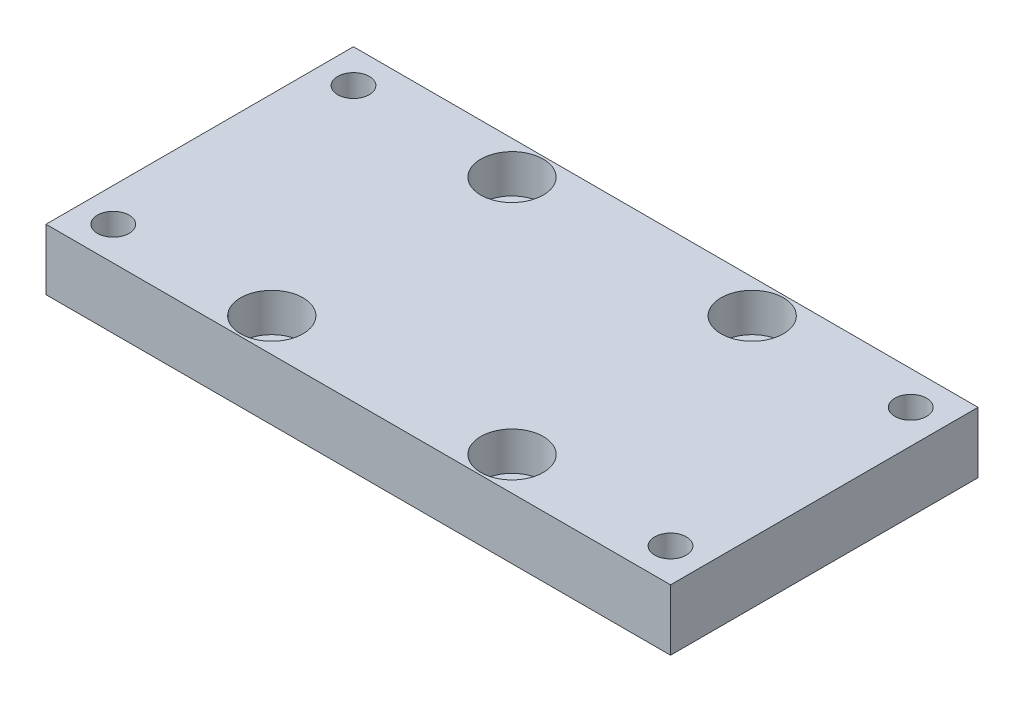
ISO-10303-21;
HEADER;
FILE_DESCRIPTION(('STEP AP214'),'2;1');
FILE_NAME('part.step','',(''),(''),'','','');
FILE_SCHEMA(('AUTOMOTIVE_DESIGN { 1 0 10303 214 1 1 1 1 }'));
ENDSEC;
DATA;
#1=APPLICATION_CONTEXT('core data for automotive mechanical design processes');
#2=APPLICATION_PROTOCOL_DEFINITION('international standard','automotive_design',2000,#1);
#3=PRODUCT_CONTEXT('',#1,'mechanical');
#4=PRODUCT('Part','Part','',(#3));
#5=PRODUCT_RELATED_PRODUCT_CATEGORY('part','',(#4));
#6=PRODUCT_DEFINITION_FORMATION('','',#4);
#7=PRODUCT_DEFINITION_CONTEXT('part definition',#1,'design');
#8=PRODUCT_DEFINITION('design','',#6,#7);
#9=PRODUCT_DEFINITION_SHAPE('','',#8);
#10=(LENGTH_UNIT() NAMED_UNIT(*) SI_UNIT(.MILLI.,.METRE.));
#11=(NAMED_UNIT(*) PLANE_ANGLE_UNIT() SI_UNIT($,.RADIAN.));
#12=(NAMED_UNIT(*) SI_UNIT($,.STERADIAN.) SOLID_ANGLE_UNIT());
#13=UNCERTAINTY_MEASURE_WITH_UNIT(LENGTH_MEASURE(1.E-05),#10,'distance_accuracy_value','');
#14=(GEOMETRIC_REPRESENTATION_CONTEXT(3) GLOBAL_UNCERTAINTY_ASSIGNED_CONTEXT((#13)) GLOBAL_UNIT_ASSIGNED_CONTEXT((#10,
#11,#12)) REPRESENTATION_CONTEXT('',''));
#15=CARTESIAN_POINT('',(0.,0.,0.));
#16=DIRECTION('',(0.,0.,1.));
#17=DIRECTION('',(1.,0.,0.));
#18=AXIS2_PLACEMENT_3D('',#15,#16,#17);
#19=CARTESIAN_POINT('',(32.5,6.35,16.));
#20=DIRECTION('',(-1.,0.,0.));
#21=DIRECTION('',(0.,0.,1.));
#22=AXIS2_PLACEMENT_3D('',#19,#20,#21);
#23=PLANE('',#22);
#24=DIRECTION('',(0.,0.,-1.));
#25=VECTOR('',#24,1.);
#26=CARTESIAN_POINT('',(32.5,0.,16.));
#27=LINE('',#26,#25);
#28=CARTESIAN_POINT('',(32.5,0.,16.));
#29=VERTEX_POINT('',#28);
#30=CARTESIAN_POINT('',(32.5,0.,-16.));
#31=VERTEX_POINT('',#30);
#32=EDGE_CURVE('E97',#29,#31,#27,.T.);
#33=ORIENTED_EDGE('',*,*,#32,.T.);
#34=DIRECTION('',(0.,-1.,0.));
#35=VECTOR('',#34,1.);
#36=CARTESIAN_POINT('',(32.5,6.35,-16.));
#37=LINE('',#36,#35);
#38=CARTESIAN_POINT('',(32.5,6.35,-16.));
#39=VERTEX_POINT('',#38);
#40=EDGE_CURVE('E11',#39,#31,#37,.T.);
#41=ORIENTED_EDGE('',*,*,#40,.F.);
#42=DIRECTION('',(0.,0.,-1.));
#43=VECTOR('',#42,1.);
#44=CARTESIAN_POINT('',(32.5,6.35,16.));
#45=LINE('',#44,#43);
#46=CARTESIAN_POINT('',(32.5,6.35,16.));
#47=VERTEX_POINT('',#46);
#48=EDGE_CURVE('E84',#47,#39,#45,.T.);
#49=ORIENTED_EDGE('',*,*,#48,.F.);
#50=DIRECTION('',(0.,-1.,0.));
#51=VECTOR('',#50,1.);
#52=CARTESIAN_POINT('',(32.5,6.35,16.));
#53=LINE('',#52,#51);
#54=EDGE_CURVE('E93',#47,#29,#53,.T.);
#55=ORIENTED_EDGE('',*,*,#54,.T.);
#56=EDGE_LOOP('',(#33,#41,#49,#55));
#57=FACE_BOUND('',#56,.T.);
#58=ADVANCED_FACE('F31',(#57),#23,.F.);
#59=CARTESIAN_POINT('',(-32.5,6.35,-16.));
#60=DIRECTION('',(0.,0.,1.));
#61=DIRECTION('',(1.,0.,0.));
#62=AXIS2_PLACEMENT_3D('',#59,#60,#61);
#63=PLANE('',#62);
#64=DIRECTION('',(-1.,0.,0.));
#65=VECTOR('',#64,1.);
#66=CARTESIAN_POINT('',(-32.5,0.,-16.));
#67=LINE('',#66,#65);
#68=CARTESIAN_POINT('',(-32.5,0.,-16.));
#69=VERTEX_POINT('',#68);
#70=EDGE_CURVE('E88',#31,#69,#67,.T.);
#71=ORIENTED_EDGE('',*,*,#70,.T.);
#72=DIRECTION('',(0.,-1.,0.));
#73=VECTOR('',#72,1.);
#74=CARTESIAN_POINT('',(-32.5,6.35,-16.));
#75=LINE('',#74,#73);
#76=CARTESIAN_POINT('',(-32.5,6.35,-16.));
#77=VERTEX_POINT('',#76);
#78=EDGE_CURVE('E40',#77,#69,#75,.T.);
#79=ORIENTED_EDGE('',*,*,#78,.F.);
#80=DIRECTION('',(-1.,0.,0.));
#81=VECTOR('',#80,1.);
#82=CARTESIAN_POINT('',(-32.5,6.35,-16.));
#83=LINE('',#82,#81);
#84=EDGE_CURVE('E79',#39,#77,#83,.T.);
#85=ORIENTED_EDGE('',*,*,#84,.F.);
#86=ORIENTED_EDGE('',*,*,#40,.T.);
#87=EDGE_LOOP('',(#71,#79,#85,#86));
#88=FACE_BOUND('',#87,.T.);
#89=ADVANCED_FACE('F87',(#88),#63,.F.);
#90=CARTESIAN_POINT('',(-32.5,6.35,16.));
#91=DIRECTION('',(1.,0.,0.));
#92=DIRECTION('',(0.,0.,-1.));
#93=AXIS2_PLACEMENT_3D('',#90,#91,#92);
#94=PLANE('',#93);
#95=DIRECTION('',(0.,0.,1.));
#96=VECTOR('',#95,1.);
#97=CARTESIAN_POINT('',(-32.5,0.,16.));
#98=LINE('',#97,#96);
#99=CARTESIAN_POINT('',(-32.5,0.,16.));
#100=VERTEX_POINT('',#99);
#101=EDGE_CURVE('E66',#69,#100,#98,.T.);
#102=ORIENTED_EDGE('',*,*,#101,.T.);
#103=DIRECTION('',(0.,-1.,0.));
#104=VECTOR('',#103,1.);
#105=CARTESIAN_POINT('',(-32.5,6.35,16.));
#106=LINE('',#105,#104);
#107=CARTESIAN_POINT('',(-32.5,6.35,16.));
#108=VERTEX_POINT('',#107);
#109=EDGE_CURVE('E89',#108,#100,#106,.T.);
#110=ORIENTED_EDGE('',*,*,#109,.F.);
#111=DIRECTION('',(0.,0.,1.));
#112=VECTOR('',#111,1.);
#113=CARTESIAN_POINT('',(-32.5,6.35,16.));
#114=LINE('',#113,#112);
#115=EDGE_CURVE('E82',#77,#108,#114,.T.);
#116=ORIENTED_EDGE('',*,*,#115,.F.);
#117=ORIENTED_EDGE('',*,*,#78,.T.);
#118=EDGE_LOOP('',(#102,#110,#116,#117));
#119=FACE_BOUND('',#118,.T.);
#120=ADVANCED_FACE('F91',(#119),#94,.F.);
#121=CARTESIAN_POINT('',(-32.5,6.35,16.));
#122=DIRECTION('',(0.,0.,-1.));
#123=DIRECTION('',(-1.,0.,0.));
#124=AXIS2_PLACEMENT_3D('',#121,#122,#123);
#125=PLANE('',#124);
#126=DIRECTION('',(1.,0.,0.));
#127=VECTOR('',#126,1.);
#128=CARTESIAN_POINT('',(-32.5,0.,16.));
#129=LINE('',#128,#127);
#130=EDGE_CURVE('E72',#100,#29,#129,.T.);
#131=ORIENTED_EDGE('',*,*,#130,.T.);
#132=ORIENTED_EDGE('',*,*,#54,.F.);
#133=DIRECTION('',(1.,0.,0.));
#134=VECTOR('',#133,1.);
#135=CARTESIAN_POINT('',(-32.5,6.35,16.));
#136=LINE('',#135,#134);
#137=EDGE_CURVE('E49',#108,#47,#136,.T.);
#138=ORIENTED_EDGE('',*,*,#137,.F.);
#139=ORIENTED_EDGE('',*,*,#109,.T.);
#140=EDGE_LOOP('',(#131,#132,#138,#139));
#141=FACE_BOUND('',#140,.T.);
#142=ADVANCED_FACE('F201',(#141),#125,.F.);
#143=CARTESIAN_POINT('',(32.5,6.35,-16.));
#144=DIRECTION('',(0.,-1.,0.));
#145=DIRECTION('',(0.,0.,-1.));
#146=AXIS2_PLACEMENT_3D('',#143,#144,#145);
#147=PLANE('',#146);
#148=CARTESIAN_POINT('',(29.,6.35,12.5));
#149=DIRECTION('',(0.,1.,0.));
#150=DIRECTION('',(0.,0.,1.));
#151=AXIS2_PLACEMENT_3D('',#148,#149,#150);
#152=CIRCLE('',#151,1.65);
#153=CARTESIAN_POINT('',(29.,6.35,14.15));
#154=VERTEX_POINT('',#153);
#155=EDGE_CURVE('E126',#154,#154,#152,.T.);
#156=ORIENTED_EDGE('',*,*,#155,.F.);
#157=EDGE_LOOP('',(#156));
#158=FACE_BOUND('',#157,.T.);
#159=CARTESIAN_POINT('',(29.,6.35,-12.5));
#160=DIRECTION('',(0.,1.,0.));
#161=DIRECTION('',(0.,0.,1.));
#162=AXIS2_PLACEMENT_3D('',#159,#160,#161);
#163=CIRCLE('',#162,1.65);
#164=CARTESIAN_POINT('',(29.,6.35,-10.85));
#165=VERTEX_POINT('',#164);
#166=EDGE_CURVE('E116',#165,#165,#163,.T.);
#167=ORIENTED_EDGE('',*,*,#166,.F.);
#168=EDGE_LOOP('',(#167));
#169=FACE_BOUND('',#168,.T.);
#170=CARTESIAN_POINT('',(-29.,6.35,12.5));
#171=DIRECTION('',(0.,1.,0.));
#172=DIRECTION('',(0.,0.,1.));
#173=AXIS2_PLACEMENT_3D('',#170,#171,#172);
#174=CIRCLE('',#173,1.65);
#175=CARTESIAN_POINT('',(-29.,6.35,14.15));
#176=VERTEX_POINT('',#175);
#177=EDGE_CURVE('E113',#176,#176,#174,.T.);
#178=ORIENTED_EDGE('',*,*,#177,.F.);
#179=EDGE_LOOP('',(#178));
#180=FACE_BOUND('',#179,.T.);
#181=CARTESIAN_POINT('',(-29.,6.35,-12.5));
#182=DIRECTION('',(0.,1.,0.));
#183=DIRECTION('',(0.,0.,1.));
#184=AXIS2_PLACEMENT_3D('',#181,#182,#183);
#185=CIRCLE('',#184,1.65);
#186=CARTESIAN_POINT('',(-29.,6.35,-10.85));
#187=VERTEX_POINT('',#186);
#188=EDGE_CURVE('E110',#187,#187,#185,.T.);
#189=ORIENTED_EDGE('',*,*,#188,.F.);
#190=EDGE_LOOP('',(#189));
#191=FACE_BOUND('',#190,.T.);
#192=CARTESIAN_POINT('',(12.5,6.35,12.5));
#193=DIRECTION('',(0.,1.,0.));
#194=DIRECTION('',(0.,0.,1.));
#195=AXIS2_PLACEMENT_3D('',#192,#193,#194);
#196=CIRCLE('',#195,3.25);
#197=CARTESIAN_POINT('',(12.5,6.35,15.75));
#198=VERTEX_POINT('',#197);
#199=EDGE_CURVE('E109',#198,#198,#196,.T.);
#200=ORIENTED_EDGE('',*,*,#199,.F.);
#201=EDGE_LOOP('',(#200));
#202=FACE_BOUND('',#201,.T.);
#203=CARTESIAN_POINT('',(12.5,6.35,-12.5));
#204=DIRECTION('',(0.,1.,0.));
#205=DIRECTION('',(0.,0.,1.));
#206=AXIS2_PLACEMENT_3D('',#203,#204,#205);
#207=CIRCLE('',#206,3.25);
#208=CARTESIAN_POINT('',(12.5,6.35,-9.25000000000001));
#209=VERTEX_POINT('',#208);
#210=EDGE_CURVE('E142',#209,#209,#207,.T.);
#211=ORIENTED_EDGE('',*,*,#210,.F.);
#212=EDGE_LOOP('',(#211));
#213=FACE_BOUND('',#212,.T.);
#214=CARTESIAN_POINT('',(-12.5,6.35,12.5));
#215=DIRECTION('',(0.,1.,0.));
#216=DIRECTION('',(0.,0.,1.));
#217=AXIS2_PLACEMENT_3D('',#214,#215,#216);
#218=CIRCLE('',#217,3.25);
#219=CARTESIAN_POINT('',(-12.5,6.35,15.75));
#220=VERTEX_POINT('',#219);
#221=EDGE_CURVE('E154',#220,#220,#218,.T.);
#222=ORIENTED_EDGE('',*,*,#221,.F.);
#223=EDGE_LOOP('',(#222));
#224=FACE_BOUND('',#223,.T.);
#225=CARTESIAN_POINT('',(-12.5,6.35,-12.5));
#226=DIRECTION('',(0.,1.,0.));
#227=DIRECTION('',(0.,0.,1.));
#228=AXIS2_PLACEMENT_3D('',#225,#226,#227);
#229=CIRCLE('',#228,3.25);
#230=CARTESIAN_POINT('',(-12.5,6.35,-9.25000000000001));
#231=VERTEX_POINT('',#230);
#232=EDGE_CURVE('E166',#231,#231,#229,.T.);
#233=ORIENTED_EDGE('',*,*,#232,.F.);
#234=EDGE_LOOP('',(#233));
#235=FACE_BOUND('',#234,.T.);
#236=ORIENTED_EDGE('',*,*,#48,.T.);
#237=ORIENTED_EDGE('',*,*,#84,.T.);
#238=ORIENTED_EDGE('',*,*,#115,.T.);
#239=ORIENTED_EDGE('',*,*,#137,.T.);
#240=EDGE_LOOP('',(#236,#237,#238,#239));
#241=FACE_BOUND('',#240,.T.);
#242=ADVANCED_FACE('F80',(#158,#169,#180,#191,#202,#213,#224,#235,#241),#147,.F.);
#243=CARTESIAN_POINT('',(32.5,0.,-16.));
#244=DIRECTION('',(0.,-1.,0.));
#245=DIRECTION('',(0.,0.,-1.));
#246=AXIS2_PLACEMENT_3D('',#243,#244,#245);
#247=PLANE('',#246);
#248=CARTESIAN_POINT('',(29.,0.,12.5));
#249=DIRECTION('',(0.,-1.,0.));
#250=DIRECTION('',(0.,0.,-1.));
#251=AXIS2_PLACEMENT_3D('',#248,#249,#250);
#252=CIRCLE('',#251,1.65);
#253=CARTESIAN_POINT('',(29.,0.,10.85));
#254=VERTEX_POINT('',#253);
#255=EDGE_CURVE('E34',#254,#254,#252,.T.);
#256=ORIENTED_EDGE('',*,*,#255,.F.);
#257=EDGE_LOOP('',(#256));
#258=FACE_BOUND('',#257,.T.);
#259=CARTESIAN_POINT('',(29.,0.,-12.5));
#260=DIRECTION('',(0.,-1.,0.));
#261=DIRECTION('',(0.,0.,-1.));
#262=AXIS2_PLACEMENT_3D('',#259,#260,#261);
#263=CIRCLE('',#262,1.65);
#264=CARTESIAN_POINT('',(29.,0.,-14.15));
#265=VERTEX_POINT('',#264);
#266=EDGE_CURVE('E114',#265,#265,#263,.T.);
#267=ORIENTED_EDGE('',*,*,#266,.F.);
#268=EDGE_LOOP('',(#267));
#269=FACE_BOUND('',#268,.T.);
#270=CARTESIAN_POINT('',(-29.,0.,12.5));
#271=DIRECTION('',(0.,-1.,0.));
#272=DIRECTION('',(0.,0.,-1.));
#273=AXIS2_PLACEMENT_3D('',#270,#271,#272);
#274=CIRCLE('',#273,1.65);
#275=CARTESIAN_POINT('',(-29.,0.,10.85));
#276=VERTEX_POINT('',#275);
#277=EDGE_CURVE('E111',#276,#276,#274,.T.);
#278=ORIENTED_EDGE('',*,*,#277,.F.);
#279=EDGE_LOOP('',(#278));
#280=FACE_BOUND('',#279,.T.);
#281=CARTESIAN_POINT('',(-29.,0.,-12.5));
#282=DIRECTION('',(0.,-1.,0.));
#283=DIRECTION('',(0.,0.,-1.));
#284=AXIS2_PLACEMENT_3D('',#281,#282,#283);
#285=CIRCLE('',#284,1.65);
#286=CARTESIAN_POINT('',(-29.,0.,-14.15));
#287=VERTEX_POINT('',#286);
#288=EDGE_CURVE('E106',#287,#287,#285,.T.);
#289=ORIENTED_EDGE('',*,*,#288,.F.);
#290=EDGE_LOOP('',(#289));
#291=FACE_BOUND('',#290,.T.);
#292=CARTESIAN_POINT('',(12.5,0.,12.5));
#293=DIRECTION('',(0.,1.,0.));
#294=DIRECTION('',(0.,0.,1.));
#295=AXIS2_PLACEMENT_3D('',#292,#293,#294);
#296=CIRCLE('',#295,1.7);
#297=CARTESIAN_POINT('',(12.5,0.,14.2));
#298=VERTEX_POINT('',#297);
#299=EDGE_CURVE('E139',#298,#298,#296,.T.);
#300=ORIENTED_EDGE('',*,*,#299,.T.);
#301=EDGE_LOOP('',(#300));
#302=FACE_BOUND('',#301,.T.);
#303=CARTESIAN_POINT('',(12.5,0.,-12.5));
#304=DIRECTION('',(0.,1.,0.));
#305=DIRECTION('',(0.,0.,1.));
#306=AXIS2_PLACEMENT_3D('',#303,#304,#305);
#307=CIRCLE('',#306,1.7);
#308=CARTESIAN_POINT('',(12.5,0.,-10.8));
#309=VERTEX_POINT('',#308);
#310=EDGE_CURVE('E151',#309,#309,#307,.T.);
#311=ORIENTED_EDGE('',*,*,#310,.T.);
#312=EDGE_LOOP('',(#311));
#313=FACE_BOUND('',#312,.T.);
#314=CARTESIAN_POINT('',(-12.5,0.,12.5));
#315=DIRECTION('',(0.,1.,0.));
#316=DIRECTION('',(0.,0.,1.));
#317=AXIS2_PLACEMENT_3D('',#314,#315,#316);
#318=CIRCLE('',#317,1.7);
#319=CARTESIAN_POINT('',(-12.5,0.,14.2));
#320=VERTEX_POINT('',#319);
#321=EDGE_CURVE('E163',#320,#320,#318,.T.);
#322=ORIENTED_EDGE('',*,*,#321,.T.);
#323=EDGE_LOOP('',(#322));
#324=FACE_BOUND('',#323,.T.);
#325=CARTESIAN_POINT('',(-12.5,0.,-12.5));
#326=DIRECTION('',(0.,1.,0.));
#327=DIRECTION('',(0.,0.,1.));
#328=AXIS2_PLACEMENT_3D('',#325,#326,#327);
#329=CIRCLE('',#328,1.7);
#330=CARTESIAN_POINT('',(-12.5,0.,-10.8));
#331=VERTEX_POINT('',#330);
#332=EDGE_CURVE('E100',#331,#331,#329,.T.);
#333=ORIENTED_EDGE('',*,*,#332,.T.);
#334=EDGE_LOOP('',(#333));
#335=FACE_BOUND('',#334,.T.);
#336=ORIENTED_EDGE('',*,*,#32,.F.);
#337=ORIENTED_EDGE('',*,*,#130,.F.);
#338=ORIENTED_EDGE('',*,*,#101,.F.);
#339=ORIENTED_EDGE('',*,*,#70,.F.);
#340=EDGE_LOOP('',(#336,#337,#338,#339));
#341=FACE_BOUND('',#340,.T.);
#342=ADVANCED_FACE('F178',(#258,#269,#280,#291,#302,#313,#324,#335,#341),#247,.T.);
#343=CARTESIAN_POINT('',(-12.5,6.35,-12.5));
#344=DIRECTION('',(0.,1.,0.));
#345=DIRECTION('',(0.,0.,1.));
#346=AXIS2_PLACEMENT_3D('',#343,#344,#345);
#347=CYLINDRICAL_SURFACE('',#346,1.70000000000001);
#348=ORIENTED_EDGE('',*,*,#332,.F.);
#349=EDGE_LOOP('',(#348));
#350=FACE_BOUND('',#349,.T.);
#351=CARTESIAN_POINT('',(-12.5,2.35,-12.5));
#352=DIRECTION('',(0.,1.,0.));
#353=DIRECTION('',(0.,0.,1.));
#354=AXIS2_PLACEMENT_3D('',#351,#352,#353);
#355=CIRCLE('',#354,1.70000000000001);
#356=CARTESIAN_POINT('',(-12.5,2.35,-10.8));
#357=VERTEX_POINT('',#356);
#358=EDGE_CURVE('E172',#357,#357,#355,.T.);
#359=ORIENTED_EDGE('',*,*,#358,.T.);
#360=EDGE_LOOP('',(#359));
#361=FACE_BOUND('',#360,.T.);
#362=ADVANCED_FACE('F181',(#350,#361),#347,.F.);
#363=CARTESIAN_POINT('',(-10.8,2.35,-12.5));
#364=DIRECTION('',(0.,-1.,0.));
#365=DIRECTION('',(0.,0.,-1.));
#366=AXIS2_PLACEMENT_3D('',#363,#364,#365);
#367=PLANE('',#366);
#368=ORIENTED_EDGE('',*,*,#358,.F.);
#369=EDGE_LOOP('',(#368));
#370=FACE_BOUND('',#369,.T.);
#371=CARTESIAN_POINT('',(-12.5,2.35,-12.5));
#372=DIRECTION('',(0.,1.,0.));
#373=DIRECTION('',(0.,0.,1.));
#374=AXIS2_PLACEMENT_3D('',#371,#372,#373);
#375=CIRCLE('',#374,3.25);
#376=CARTESIAN_POINT('',(-12.5,2.35,-9.25000000000001));
#377=VERTEX_POINT('',#376);
#378=EDGE_CURVE('E169',#377,#377,#375,.T.);
#379=ORIENTED_EDGE('',*,*,#378,.T.);
#380=EDGE_LOOP('',(#379));
#381=FACE_BOUND('',#380,.T.);
#382=ADVANCED_FACE('F184',(#370,#381),#367,.F.);
#383=CARTESIAN_POINT('',(-12.5,6.35,-12.5));
#384=DIRECTION('',(0.,1.,0.));
#385=DIRECTION('',(0.,0.,1.));
#386=AXIS2_PLACEMENT_3D('',#383,#384,#385);
#387=CYLINDRICAL_SURFACE('',#386,3.25);
#388=ORIENTED_EDGE('',*,*,#378,.F.);
#389=EDGE_LOOP('',(#388));
#390=FACE_BOUND('',#389,.T.);
#391=ORIENTED_EDGE('',*,*,#232,.T.);
#392=EDGE_LOOP('',(#391));
#393=FACE_BOUND('',#392,.T.);
#394=ADVANCED_FACE('F190',(#390,#393),#387,.F.);
#395=CARTESIAN_POINT('',(-12.5,6.35,12.5));
#396=DIRECTION('',(0.,1.,0.));
#397=DIRECTION('',(0.,0.,1.));
#398=AXIS2_PLACEMENT_3D('',#395,#396,#397);
#399=CYLINDRICAL_SURFACE('',#398,1.70000000000001);
#400=ORIENTED_EDGE('',*,*,#321,.F.);
#401=EDGE_LOOP('',(#400));
#402=FACE_BOUND('',#401,.T.);
#403=CARTESIAN_POINT('',(-12.5,2.35,12.5));
#404=DIRECTION('',(0.,1.,0.));
#405=DIRECTION('',(0.,0.,1.));
#406=AXIS2_PLACEMENT_3D('',#403,#404,#405);
#407=CIRCLE('',#406,1.70000000000001);
#408=CARTESIAN_POINT('',(-12.5,2.35,14.2));
#409=VERTEX_POINT('',#408);
#410=EDGE_CURVE('E160',#409,#409,#407,.T.);
#411=ORIENTED_EDGE('',*,*,#410,.T.);
#412=EDGE_LOOP('',(#411));
#413=FACE_BOUND('',#412,.T.);
#414=ADVANCED_FACE('F196',(#402,#413),#399,.F.);
#415=CARTESIAN_POINT('',(-10.8,2.35,12.5));
#416=DIRECTION('',(0.,-1.,0.));
#417=DIRECTION('',(0.,0.,-1.));
#418=AXIS2_PLACEMENT_3D('',#415,#416,#417);
#419=PLANE('',#418);
#420=ORIENTED_EDGE('',*,*,#410,.F.);
#421=EDGE_LOOP('',(#420));
#422=FACE_BOUND('',#421,.T.);
#423=CARTESIAN_POINT('',(-12.5,2.35,12.5));
#424=DIRECTION('',(0.,1.,0.));
#425=DIRECTION('',(0.,0.,1.));
#426=AXIS2_PLACEMENT_3D('',#423,#424,#425);
#427=CIRCLE('',#426,3.25);
#428=CARTESIAN_POINT('',(-12.5,2.35,15.75));
#429=VERTEX_POINT('',#428);
#430=EDGE_CURVE('E157',#429,#429,#427,.T.);
#431=ORIENTED_EDGE('',*,*,#430,.T.);
#432=EDGE_LOOP('',(#431));
#433=FACE_BOUND('',#432,.T.);
#434=ADVANCED_FACE('F258',(#422,#433),#419,.F.);
#435=CARTESIAN_POINT('',(-12.5,6.35,12.5));
#436=DIRECTION('',(0.,1.,0.));
#437=DIRECTION('',(0.,0.,1.));
#438=AXIS2_PLACEMENT_3D('',#435,#436,#437);
#439=CYLINDRICAL_SURFACE('',#438,3.25);
#440=ORIENTED_EDGE('',*,*,#430,.F.);
#441=EDGE_LOOP('',(#440));
#442=FACE_BOUND('',#441,.T.);
#443=ORIENTED_EDGE('',*,*,#221,.T.);
#444=EDGE_LOOP('',(#443));
#445=FACE_BOUND('',#444,.T.);
#446=ADVANCED_FACE('F268',(#442,#445),#439,.F.);
#447=CARTESIAN_POINT('',(12.5,6.35,-12.5));
#448=DIRECTION('',(0.,1.,0.));
#449=DIRECTION('',(0.,0.,1.));
#450=AXIS2_PLACEMENT_3D('',#447,#448,#449);
#451=CYLINDRICAL_SURFACE('',#450,1.70000000000001);
#452=ORIENTED_EDGE('',*,*,#310,.F.);
#453=EDGE_LOOP('',(#452));
#454=FACE_BOUND('',#453,.T.);
#455=CARTESIAN_POINT('',(12.5,2.35,-12.5));
#456=DIRECTION('',(0.,1.,0.));
#457=DIRECTION('',(0.,0.,1.));
#458=AXIS2_PLACEMENT_3D('',#455,#456,#457);
#459=CIRCLE('',#458,1.70000000000001);
#460=CARTESIAN_POINT('',(12.5,2.35,-10.8));
#461=VERTEX_POINT('',#460);
#462=EDGE_CURVE('E148',#461,#461,#459,.T.);
#463=ORIENTED_EDGE('',*,*,#462,.T.);
#464=EDGE_LOOP('',(#463));
#465=FACE_BOUND('',#464,.T.);
#466=ADVANCED_FACE('F278',(#454,#465),#451,.F.);
#467=CARTESIAN_POINT('',(14.2,2.35,-12.5));
#468=DIRECTION('',(0.,-1.,0.));
#469=DIRECTION('',(0.,0.,-1.));
#470=AXIS2_PLACEMENT_3D('',#467,#468,#469);
#471=PLANE('',#470);
#472=ORIENTED_EDGE('',*,*,#462,.F.);
#473=EDGE_LOOP('',(#472));
#474=FACE_BOUND('',#473,.T.);
#475=CARTESIAN_POINT('',(12.5,2.35,-12.5));
#476=DIRECTION('',(0.,1.,0.));
#477=DIRECTION('',(0.,0.,1.));
#478=AXIS2_PLACEMENT_3D('',#475,#476,#477);
#479=CIRCLE('',#478,3.25);
#480=CARTESIAN_POINT('',(12.5,2.35,-9.25000000000001));
#481=VERTEX_POINT('',#480);
#482=EDGE_CURVE('E145',#481,#481,#479,.T.);
#483=ORIENTED_EDGE('',*,*,#482,.T.);
#484=EDGE_LOOP('',(#483));
#485=FACE_BOUND('',#484,.T.);
#486=ADVANCED_FACE('F288',(#474,#485),#471,.F.);
#487=CARTESIAN_POINT('',(12.5,6.35,-12.5));
#488=DIRECTION('',(0.,1.,0.));
#489=DIRECTION('',(0.,0.,1.));
#490=AXIS2_PLACEMENT_3D('',#487,#488,#489);
#491=CYLINDRICAL_SURFACE('',#490,3.25);
#492=ORIENTED_EDGE('',*,*,#482,.F.);
#493=EDGE_LOOP('',(#492));
#494=FACE_BOUND('',#493,.T.);
#495=ORIENTED_EDGE('',*,*,#210,.T.);
#496=EDGE_LOOP('',(#495));
#497=FACE_BOUND('',#496,.T.);
#498=ADVANCED_FACE('F298',(#494,#497),#491,.F.);
#499=CARTESIAN_POINT('',(12.5,6.35,12.5));
#500=DIRECTION('',(0.,1.,0.));
#501=DIRECTION('',(0.,0.,1.));
#502=AXIS2_PLACEMENT_3D('',#499,#500,#501);
#503=CYLINDRICAL_SURFACE('',#502,1.70000000000001);
#504=ORIENTED_EDGE('',*,*,#299,.F.);
#505=EDGE_LOOP('',(#504));
#506=FACE_BOUND('',#505,.T.);
#507=CARTESIAN_POINT('',(12.5,2.35,12.5));
#508=DIRECTION('',(0.,1.,0.));
#509=DIRECTION('',(0.,0.,1.));
#510=AXIS2_PLACEMENT_3D('',#507,#508,#509);
#511=CIRCLE('',#510,1.70000000000001);
#512=CARTESIAN_POINT('',(12.5,2.35,14.2));
#513=VERTEX_POINT('',#512);
#514=EDGE_CURVE('E136',#513,#513,#511,.T.);
#515=ORIENTED_EDGE('',*,*,#514,.T.);
#516=EDGE_LOOP('',(#515));
#517=FACE_BOUND('',#516,.T.);
#518=ADVANCED_FACE('F308',(#506,#517),#503,.F.);
#519=CARTESIAN_POINT('',(14.2,2.35,12.5));
#520=DIRECTION('',(0.,-1.,0.));
#521=DIRECTION('',(0.,0.,-1.));
#522=AXIS2_PLACEMENT_3D('',#519,#520,#521);
#523=PLANE('',#522);
#524=ORIENTED_EDGE('',*,*,#514,.F.);
#525=EDGE_LOOP('',(#524));
#526=FACE_BOUND('',#525,.T.);
#527=CARTESIAN_POINT('',(12.5,2.35,12.5));
#528=DIRECTION('',(0.,1.,0.));
#529=DIRECTION('',(0.,0.,1.));
#530=AXIS2_PLACEMENT_3D('',#527,#528,#529);
#531=CIRCLE('',#530,3.25);
#532=CARTESIAN_POINT('',(12.5,2.35,15.75));
#533=VERTEX_POINT('',#532);
#534=EDGE_CURVE('E133',#533,#533,#531,.T.);
#535=ORIENTED_EDGE('',*,*,#534,.T.);
#536=EDGE_LOOP('',(#535));
#537=FACE_BOUND('',#536,.T.);
#538=ADVANCED_FACE('F318',(#526,#537),#523,.F.);
#539=CARTESIAN_POINT('',(12.5,6.35,12.5));
#540=DIRECTION('',(0.,1.,0.));
#541=DIRECTION('',(0.,0.,1.));
#542=AXIS2_PLACEMENT_3D('',#539,#540,#541);
#543=CYLINDRICAL_SURFACE('',#542,3.25);
#544=ORIENTED_EDGE('',*,*,#534,.F.);
#545=EDGE_LOOP('',(#544));
#546=FACE_BOUND('',#545,.T.);
#547=ORIENTED_EDGE('',*,*,#199,.T.);
#548=EDGE_LOOP('',(#547));
#549=FACE_BOUND('',#548,.T.);
#550=ADVANCED_FACE('F328',(#546,#549),#543,.F.);
#551=CARTESIAN_POINT('',(-29.,6.35,-12.5));
#552=DIRECTION('',(0.,1.,0.));
#553=DIRECTION('',(0.,0.,1.));
#554=AXIS2_PLACEMENT_3D('',#551,#552,#553);
#555=CYLINDRICAL_SURFACE('',#554,1.65);
#556=ORIENTED_EDGE('',*,*,#288,.T.);
#557=EDGE_LOOP('',(#556));
#558=FACE_BOUND('',#557,.T.);
#559=ORIENTED_EDGE('',*,*,#188,.T.);
#560=EDGE_LOOP('',(#559));
#561=FACE_BOUND('',#560,.T.);
#562=ADVANCED_FACE('F338',(#558,#561),#555,.F.);
#563=CARTESIAN_POINT('',(-29.,6.35,12.5));
#564=DIRECTION('',(0.,1.,0.));
#565=DIRECTION('',(0.,0.,1.));
#566=AXIS2_PLACEMENT_3D('',#563,#564,#565);
#567=CYLINDRICAL_SURFACE('',#566,1.65);
#568=ORIENTED_EDGE('',*,*,#277,.T.);
#569=EDGE_LOOP('',(#568));
#570=FACE_BOUND('',#569,.T.);
#571=ORIENTED_EDGE('',*,*,#177,.T.);
#572=EDGE_LOOP('',(#571));
#573=FACE_BOUND('',#572,.T.);
#574=ADVANCED_FACE('F347',(#570,#573),#567,.F.);
#575=CARTESIAN_POINT('',(29.,6.35,-12.5));
#576=DIRECTION('',(0.,1.,0.));
#577=DIRECTION('',(0.,0.,1.));
#578=AXIS2_PLACEMENT_3D('',#575,#576,#577);
#579=CYLINDRICAL_SURFACE('',#578,1.65);
#580=ORIENTED_EDGE('',*,*,#266,.T.);
#581=EDGE_LOOP('',(#580));
#582=FACE_BOUND('',#581,.T.);
#583=ORIENTED_EDGE('',*,*,#166,.T.);
#584=EDGE_LOOP('',(#583));
#585=FACE_BOUND('',#584,.T.);
#586=ADVANCED_FACE('F366',(#582,#585),#579,.F.);
#587=CARTESIAN_POINT('',(29.,6.35,12.5));
#588=DIRECTION('',(0.,1.,0.));
#589=DIRECTION('',(0.,0.,1.));
#590=AXIS2_PLACEMENT_3D('',#587,#588,#589);
#591=CYLINDRICAL_SURFACE('',#590,1.65);
#592=ORIENTED_EDGE('',*,*,#255,.T.);
#593=EDGE_LOOP('',(#592));
#594=FACE_BOUND('',#593,.T.);
#595=ORIENTED_EDGE('',*,*,#155,.T.);
#596=EDGE_LOOP('',(#595));
#597=FACE_BOUND('',#596,.T.);
#598=ADVANCED_FACE('F376',(#594,#597),#591,.F.);
#599=CLOSED_SHELL('',(#58,#89,#120,#142,#242,#342,#362,#382,#394,#414,#434,#446,#466,#486,#498,
#518,#538,#550,#562,#574,#586,#598));
#600=MANIFOLD_SOLID_BREP('B2',#599);
#601=ADVANCED_BREP_SHAPE_REPRESENTATION('',(#18,#600),#14);
#602=SHAPE_DEFINITION_REPRESENTATION(#9,#601);
ENDSEC;
END-ISO-10303-21;
